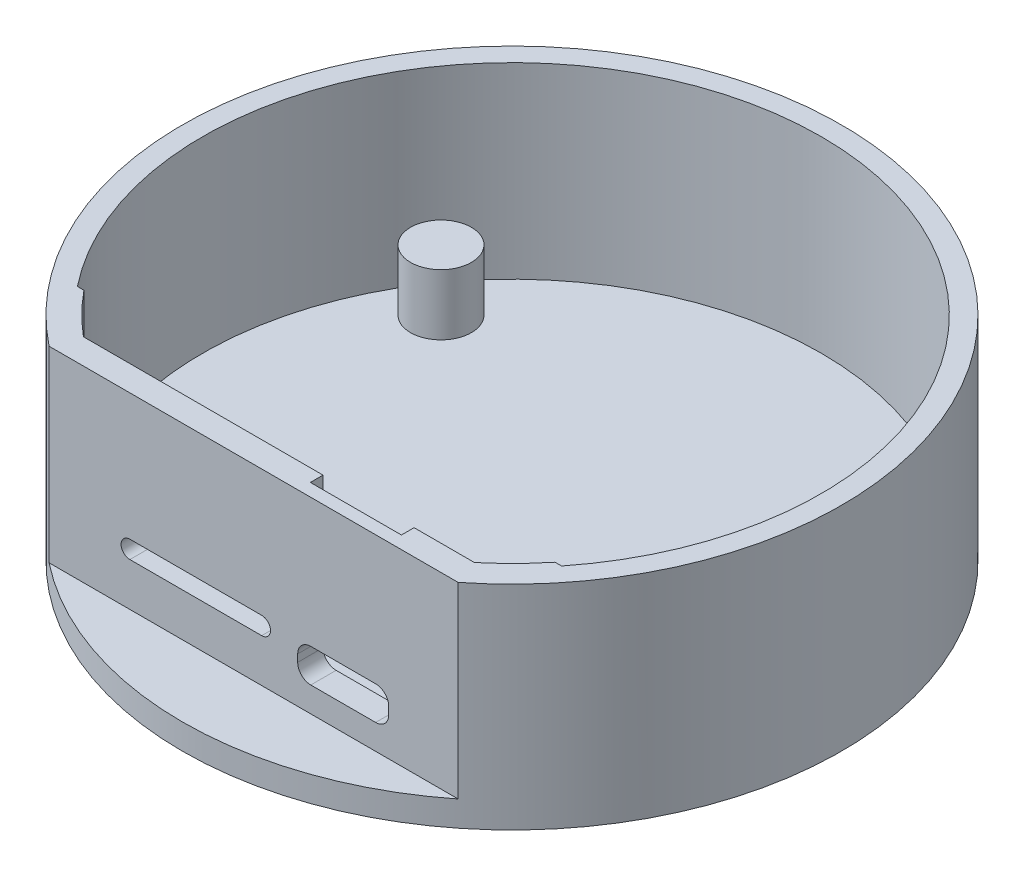
ISO-10303-21;
HEADER;
FILE_DESCRIPTION(('STEP AP214'),'2;1');
FILE_NAME('part.step','',(''),(''),'','','');
FILE_SCHEMA(('AUTOMOTIVE_DESIGN { 1 0 10303 214 1 1 1 1 }'));
ENDSEC;
DATA;
#1=APPLICATION_CONTEXT('core data for automotive mechanical design processes');
#2=APPLICATION_PROTOCOL_DEFINITION('international standard','automotive_design',2000,#1);
#3=PRODUCT_CONTEXT('',#1,'mechanical');
#4=PRODUCT('Part','Part','',(#3));
#5=PRODUCT_RELATED_PRODUCT_CATEGORY('part','',(#4));
#6=PRODUCT_DEFINITION_FORMATION('','',#4);
#7=PRODUCT_DEFINITION_CONTEXT('part definition',#1,'design');
#8=PRODUCT_DEFINITION('design','',#6,#7);
#9=PRODUCT_DEFINITION_SHAPE('','',#8);
#10=(LENGTH_UNIT() NAMED_UNIT(*) SI_UNIT(.MILLI.,.METRE.));
#11=(NAMED_UNIT(*) PLANE_ANGLE_UNIT() SI_UNIT($,.RADIAN.));
#12=(NAMED_UNIT(*) SI_UNIT($,.STERADIAN.) SOLID_ANGLE_UNIT());
#13=UNCERTAINTY_MEASURE_WITH_UNIT(LENGTH_MEASURE(1.E-05),#10,'distance_accuracy_value','');
#14=(GEOMETRIC_REPRESENTATION_CONTEXT(3) GLOBAL_UNCERTAINTY_ASSIGNED_CONTEXT((#13)) GLOBAL_UNIT_ASSIGNED_CONTEXT((#10,
#11,#12)) REPRESENTATION_CONTEXT('',''));
#15=CARTESIAN_POINT('',(0.,0.,0.));
#16=DIRECTION('',(0.,0.,1.));
#17=DIRECTION('',(1.,0.,0.));
#18=AXIS2_PLACEMENT_3D('',#15,#16,#17);
#19=CARTESIAN_POINT('',(0.,21.,0.));
#20=DIRECTION('',(0.,-1.,0.));
#21=DIRECTION('',(0.,0.,-1.));
#22=AXIS2_PLACEMENT_3D('',#19,#20,#21);
#23=CYLINDRICAL_SURFACE('',#22,30.);
#24=DIRECTION('',(0.,-1.,0.));
#25=VECTOR('',#24,1.);
#26=CARTESIAN_POINT('',(-23.2315496638173,21.,18.9814409415511));
#27=LINE('',#26,#25);
#28=CARTESIAN_POINT('',(-23.2315496638173,21.,18.9814409415511));
#29=VERTEX_POINT('',#28);
#30=CARTESIAN_POINT('',(-23.2315496638173,2.5,18.9814409415511));
#31=VERTEX_POINT('',#30);
#32=EDGE_CURVE('E48',#29,#31,#27,.T.);
#33=ORIENTED_EDGE('',*,*,#32,.F.);
#34=CARTESIAN_POINT('',(0.,21.,0.));
#35=DIRECTION('',(0.,1.,0.));
#36=DIRECTION('',(0.,0.,1.));
#37=AXIS2_PLACEMENT_3D('',#34,#35,#36);
#38=CIRCLE('',#37,30.);
#39=CARTESIAN_POINT('',(-19.2835,21.,22.9814409415511));
#40=VERTEX_POINT('',#39);
#41=EDGE_CURVE('E426',#29,#40,#38,.T.);
#42=ORIENTED_EDGE('',*,*,#41,.T.);
#43=DIRECTION('',(0.,-1.,0.));
#44=VECTOR('',#43,1.);
#45=CARTESIAN_POINT('',(-19.2835,21.,22.9814409415511));
#46=LINE('',#45,#44);
#47=CARTESIAN_POINT('',(-19.2835,2.5,22.9814409415511));
#48=VERTEX_POINT('',#47);
#49=EDGE_CURVE('E413',#48,#40,#46,.F.);
#50=ORIENTED_EDGE('',*,*,#49,.F.);
#51=CARTESIAN_POINT('',(0.,2.5,0.));
#52=DIRECTION('',(0.,1.,0.));
#53=DIRECTION('',(0.,0.,1.));
#54=AXIS2_PLACEMENT_3D('',#51,#52,#53);
#55=CIRCLE('',#54,30.);
#56=EDGE_CURVE('E421',#31,#48,#55,.T.);
#57=ORIENTED_EDGE('',*,*,#56,.F.);
#58=EDGE_LOOP('',(#33,#42,#50,#57));
#59=FACE_BOUND('',#58,.T.);
#60=ADVANCED_FACE('F39',(#59),#23,.F.);
#61=CARTESIAN_POINT('',(0.,2.5,0.));
#62=DIRECTION('',(0.,1.,0.));
#63=DIRECTION('',(0.,0.,1.));
#64=AXIS2_PLACEMENT_3D('',#61,#62,#63);
#65=PLANE('',#64);
#66=CARTESIAN_POINT('',(0.,2.5,0.));
#67=DIRECTION('',(0.,1.,0.));
#68=DIRECTION('',(0.,0.,1.));
#69=AXIS2_PLACEMENT_3D('',#66,#67,#68);
#70=CIRCLE('',#69,32.5);
#71=CARTESIAN_POINT('',(20.1729067697802,2.5,25.4814409415511));
#72=VERTEX_POINT('',#71);
#73=CARTESIAN_POINT('',(-20.1729067697802,2.5,25.4814409415511));
#74=VERTEX_POINT('',#73);
#75=EDGE_CURVE('E409',#72,#74,#70,.F.);
#76=ORIENTED_EDGE('',*,*,#75,.F.);
#77=DIRECTION('',(1.,0.,0.));
#78=VECTOR('',#77,1.);
#79=CARTESIAN_POINT('',(-20.1729067697802,2.5,25.4814409415511));
#80=LINE('',#79,#78);
#81=EDGE_CURVE('E385',#74,#72,#80,.T.);
#82=ORIENTED_EDGE('',*,*,#81,.F.);
#83=EDGE_LOOP('',(#76,#82));
#84=FACE_BOUND('',#83,.T.);
#85=ADVANCED_FACE('F517',(#84),#65,.T.);
#86=CARTESIAN_POINT('',(-17.,2.5,19.));
#87=DIRECTION('',(0.,1.,0.));
#88=DIRECTION('',(0.,0.,1.));
#89=AXIS2_PLACEMENT_3D('',#86,#87,#88);
#90=CIRCLE('',#89,3.);
#91=CARTESIAN_POINT('',(-17.,2.5,22.));
#92=VERTEX_POINT('',#91);
#93=EDGE_CURVE('E267',#92,#92,#90,.T.);
#94=ORIENTED_EDGE('',*,*,#93,.F.);
#95=EDGE_LOOP('',(#94));
#96=FACE_BOUND('',#95,.T.);
#97=CARTESIAN_POINT('',(22.,2.5,-15.));
#98=DIRECTION('',(0.,1.,0.));
#99=DIRECTION('',(0.,0.,1.));
#100=AXIS2_PLACEMENT_3D('',#97,#98,#99);
#101=CIRCLE('',#100,3.);
#102=CARTESIAN_POINT('',(22.,2.5,-12.));
#103=VERTEX_POINT('',#102);
#104=EDGE_CURVE('E344',#103,#103,#101,.T.);
#105=ORIENTED_EDGE('',*,*,#104,.F.);
#106=EDGE_LOOP('',(#105));
#107=FACE_BOUND('',#106,.T.);
#108=CARTESIAN_POINT('',(-22.,2.5,-15.));
#109=DIRECTION('',(0.,1.,0.));
#110=DIRECTION('',(0.,0.,1.));
#111=AXIS2_PLACEMENT_3D('',#108,#109,#110);
#112=CIRCLE('',#111,3.);
#113=CARTESIAN_POINT('',(-22.,2.5,-12.));
#114=VERTEX_POINT('',#113);
#115=EDGE_CURVE('E352',#114,#114,#112,.T.);
#116=ORIENTED_EDGE('',*,*,#115,.F.);
#117=EDGE_LOOP('',(#116));
#118=FACE_BOUND('',#117,.T.);
#119=CARTESIAN_POINT('',(19.2835,2.5,22.9814409415511));
#120=VERTEX_POINT('',#119);
#121=CARTESIAN_POINT('',(23.2315496638173,2.5,18.9814409415511));
#122=VERTEX_POINT('',#121);
#123=EDGE_CURVE('E422',#120,#122,#55,.T.);
#124=ORIENTED_EDGE('',*,*,#123,.T.);
#125=DIRECTION('',(-1.,0.,0.));
#126=VECTOR('',#125,1.);
#127=CARTESIAN_POINT('',(23.2315496638173,2.5,18.9814409415511));
#128=LINE('',#127,#126);
#129=CARTESIAN_POINT('',(23.8737282338224,2.5,18.9814409415511));
#130=VERTEX_POINT('',#129);
#131=EDGE_CURVE('E382',#130,#122,#128,.T.);
#132=ORIENTED_EDGE('',*,*,#131,.F.);
#133=CARTESIAN_POINT('',(0.,2.5,0.));
#134=DIRECTION('',(0.,1.,0.));
#135=DIRECTION('',(0.,0.,1.));
#136=AXIS2_PLACEMENT_3D('',#133,#134,#135);
#137=CIRCLE('',#136,30.5);
#138=CARTESIAN_POINT('',(-23.8737282338224,2.5,18.9814409415511));
#139=VERTEX_POINT('',#138);
#140=EDGE_CURVE('E364',#139,#130,#137,.F.);
#141=ORIENTED_EDGE('',*,*,#140,.F.);
#142=EDGE_CURVE('E367',#31,#139,#128,.T.);
#143=ORIENTED_EDGE('',*,*,#142,.F.);
#144=ORIENTED_EDGE('',*,*,#56,.T.);
#145=DIRECTION('',(-1.,0.,0.));
#146=VECTOR('',#145,1.);
#147=CARTESIAN_POINT('',(-22.9804998259394,2.5,22.9814409415511));
#148=LINE('',#147,#146);
#149=EDGE_CURVE('E391',#120,#48,#148,.T.);
#150=ORIENTED_EDGE('',*,*,#149,.F.);
#151=EDGE_LOOP('',(#124,#132,#141,#143,#144,#150));
#152=FACE_BOUND('',#151,.T.);
#153=ADVANCED_FACE('F473',(#96,#107,#118,#152),#65,.T.);
#154=CARTESIAN_POINT('',(0.,21.,0.));
#155=DIRECTION('',(0.,-1.,0.));
#156=DIRECTION('',(0.,0.,-1.));
#157=AXIS2_PLACEMENT_3D('',#154,#155,#156);
#158=CYLINDRICAL_SURFACE('',#157,32.5);
#159=ORIENTED_EDGE('',*,*,#75,.T.);
#160=DIRECTION('',(0.,-1.,0.));
#161=VECTOR('',#160,1.);
#162=CARTESIAN_POINT('',(-20.1729067697802,21.,25.4814409415511));
#163=LINE('',#162,#161);
#164=CARTESIAN_POINT('',(-20.1729067697802,21.,25.4814409415511));
#165=VERTEX_POINT('',#164);
#166=EDGE_CURVE('E405',#165,#74,#163,.T.);
#167=ORIENTED_EDGE('',*,*,#166,.F.);
#168=CARTESIAN_POINT('',(0.,21.,0.));
#169=DIRECTION('',(0.,1.,0.));
#170=DIRECTION('',(0.,0.,1.));
#171=AXIS2_PLACEMENT_3D('',#168,#169,#170);
#172=CIRCLE('',#171,32.5);
#173=CARTESIAN_POINT('',(20.1729067697802,21.,25.4814409415511));
#174=VERTEX_POINT('',#173);
#175=EDGE_CURVE('E432',#174,#165,#172,.T.);
#176=ORIENTED_EDGE('',*,*,#175,.F.);
#177=DIRECTION('',(0.,-1.,0.));
#178=VECTOR('',#177,1.);
#179=CARTESIAN_POINT('',(20.1729067697802,21.,25.4814409415511));
#180=LINE('',#179,#178);
#181=EDGE_CURVE('E395',#174,#72,#180,.T.);
#182=ORIENTED_EDGE('',*,*,#181,.T.);
#183=EDGE_LOOP('',(#159,#167,#176,#182));
#184=FACE_BOUND('',#183,.T.);
#185=CARTESIAN_POINT('',(0.,0.,0.));
#186=DIRECTION('',(0.,1.,0.));
#187=DIRECTION('',(0.,0.,1.));
#188=AXIS2_PLACEMENT_3D('',#185,#186,#187);
#189=CIRCLE('',#188,32.5);
#190=CARTESIAN_POINT('',(0.,0.,32.5));
#191=VERTEX_POINT('',#190);
#192=EDGE_CURVE('E431',#191,#191,#189,.T.);
#193=ORIENTED_EDGE('',*,*,#192,.T.);
#194=EDGE_LOOP('',(#193));
#195=FACE_BOUND('',#194,.T.);
#196=ADVANCED_FACE('F41',(#184,#195),#158,.T.);
#197=CARTESIAN_POINT('',(0.,21.,0.));
#198=DIRECTION('',(0.,1.,0.));
#199=DIRECTION('',(0.,0.,1.));
#200=AXIS2_PLACEMENT_3D('',#197,#198,#199);
#201=PLANE('',#200);
#202=DIRECTION('',(0.,0.,-1.));
#203=VECTOR('',#202,1.);
#204=CARTESIAN_POINT('',(13.33,21.,24.2314409415511));
#205=LINE('',#204,#203);
#206=CARTESIAN_POINT('',(13.33,21.,24.2314409415511));
#207=VERTEX_POINT('',#206);
#208=CARTESIAN_POINT('',(13.33,21.,22.9814409415511));
#209=VERTEX_POINT('',#208);
#210=EDGE_CURVE('E209',#207,#209,#205,.T.);
#211=ORIENTED_EDGE('',*,*,#210,.F.);
#212=DIRECTION('',(1.,0.,0.));
#213=VECTOR('',#212,1.);
#214=CARTESIAN_POINT('',(13.33,21.,24.2314409415511));
#215=LINE('',#214,#213);
#216=CARTESIAN_POINT('',(4.35,21.,24.2314409415511));
#217=VERTEX_POINT('',#216);
#218=EDGE_CURVE('E191',#217,#207,#215,.T.);
#219=ORIENTED_EDGE('',*,*,#218,.F.);
#220=DIRECTION('',(0.,0.,-1.));
#221=VECTOR('',#220,1.);
#222=CARTESIAN_POINT('',(4.35,21.,24.2314409415511));
#223=LINE('',#222,#221);
#224=CARTESIAN_POINT('',(4.35,21.,22.9814409415511));
#225=VERTEX_POINT('',#224);
#226=EDGE_CURVE('E201',#217,#225,#223,.T.);
#227=ORIENTED_EDGE('',*,*,#226,.T.);
#228=DIRECTION('',(-1.,0.,0.));
#229=VECTOR('',#228,1.);
#230=CARTESIAN_POINT('',(-22.9804998259394,21.,22.9814409415511));
#231=LINE('',#230,#229);
#232=EDGE_CURVE('E390',#225,#40,#231,.T.);
#233=ORIENTED_EDGE('',*,*,#232,.T.);
#234=ORIENTED_EDGE('',*,*,#41,.F.);
#235=DIRECTION('',(1.,0.,0.));
#236=VECTOR('',#235,1.);
#237=CARTESIAN_POINT('',(23.2315496638173,21.,18.9814409415511));
#238=LINE('',#237,#236);
#239=CARTESIAN_POINT('',(-23.8737282338224,21.,18.9814409415511));
#240=VERTEX_POINT('',#239);
#241=EDGE_CURVE('E373',#240,#29,#238,.T.);
#242=ORIENTED_EDGE('',*,*,#241,.F.);
#243=CARTESIAN_POINT('',(0.,21.,0.));
#244=DIRECTION('',(0.,1.,0.));
#245=DIRECTION('',(0.,0.,1.));
#246=AXIS2_PLACEMENT_3D('',#243,#244,#245);
#247=CIRCLE('',#246,30.5);
#248=CARTESIAN_POINT('',(23.8737282338224,21.,18.9814409415511));
#249=VERTEX_POINT('',#248);
#250=EDGE_CURVE('E360',#249,#240,#247,.T.);
#251=ORIENTED_EDGE('',*,*,#250,.F.);
#252=CARTESIAN_POINT('',(23.2315496638173,21.,18.9814409415511));
#253=VERTEX_POINT('',#252);
#254=EDGE_CURVE('E372',#253,#249,#238,.T.);
#255=ORIENTED_EDGE('',*,*,#254,.F.);
#256=CARTESIAN_POINT('',(19.2835,21.,22.9814409415511));
#257=VERTEX_POINT('',#256);
#258=EDGE_CURVE('E427',#257,#253,#38,.T.);
#259=ORIENTED_EDGE('',*,*,#258,.F.);
#260=EDGE_CURVE('E392',#257,#209,#231,.T.);
#261=ORIENTED_EDGE('',*,*,#260,.T.);
#262=EDGE_LOOP('',(#211,#219,#227,#233,#234,#242,#251,#255,#259,#261));
#263=FACE_BOUND('',#262,.T.);
#264=DIRECTION('',(1.,0.,0.));
#265=VECTOR('',#264,1.);
#266=CARTESIAN_POINT('',(-20.1729067697802,21.,25.4814409415511));
#267=LINE('',#266,#265);
#268=EDGE_CURVE('E386',#165,#174,#267,.T.);
#269=ORIENTED_EDGE('',*,*,#268,.T.);
#270=ORIENTED_EDGE('',*,*,#175,.T.);
#271=EDGE_LOOP('',(#269,#270));
#272=FACE_BOUND('',#271,.T.);
#273=ADVANCED_FACE('F211',(#263,#272),#201,.T.);
#274=CARTESIAN_POINT('',(0.,0.,0.));
#275=DIRECTION('',(0.,1.,0.));
#276=DIRECTION('',(0.,0.,1.));
#277=AXIS2_PLACEMENT_3D('',#274,#275,#276);
#278=PLANE('',#277);
#279=ORIENTED_EDGE('',*,*,#192,.F.);
#280=EDGE_LOOP('',(#279));
#281=FACE_BOUND('',#280,.T.);
#282=ADVANCED_FACE('F526',(#281),#278,.F.);
#283=DIRECTION('',(0.,-1.,0.));
#284=VECTOR('',#283,1.);
#285=CARTESIAN_POINT('',(23.2315496638173,21.,18.9814409415511));
#286=LINE('',#285,#284);
#287=EDGE_CURVE('E435',#122,#253,#286,.F.);
#288=ORIENTED_EDGE('',*,*,#287,.F.);
#289=ORIENTED_EDGE('',*,*,#123,.F.);
#290=DIRECTION('',(0.,-1.,0.));
#291=VECTOR('',#290,1.);
#292=CARTESIAN_POINT('',(19.2835,21.,22.9814409415511));
#293=LINE('',#292,#291);
#294=EDGE_CURVE('E417',#257,#120,#293,.T.);
#295=ORIENTED_EDGE('',*,*,#294,.F.);
#296=ORIENTED_EDGE('',*,*,#258,.T.);
#297=EDGE_LOOP('',(#288,#289,#295,#296));
#298=FACE_BOUND('',#297,.T.);
#299=ADVANCED_FACE('F475',(#298),#23,.F.);
#300=CARTESIAN_POINT('',(-20.1729067697802,21.,25.4814409415511));
#301=DIRECTION('',(0.,0.,-1.));
#302=DIRECTION('',(-1.,0.,0.));
#303=AXIS2_PLACEMENT_3D('',#300,#301,#302);
#304=PLANE('',#303);
#305=DIRECTION('',(1.,0.,0.));
#306=VECTOR('',#305,1.);
#307=CARTESIAN_POINT('',(-12.2,6.76457579412948,25.4814409415511));
#308=LINE('',#307,#306);
#309=CARTESIAN_POINT('',(-12.2,6.76457579412948,25.4814409415511));
#310=VERTEX_POINT('',#309);
#311=CARTESIAN_POINT('',(0.799999999999998,6.76457579412948,25.4814409415511));
#312=VERTEX_POINT('',#311);
#313=EDGE_CURVE('E239',#310,#312,#308,.T.);
#314=ORIENTED_EDGE('',*,*,#313,.F.);
#315=CARTESIAN_POINT('',(-12.2,7.63228789706474,25.4814409415511));
#316=DIRECTION('',(0.,0.,1.));
#317=DIRECTION('',(1.,0.,0.));
#318=AXIS2_PLACEMENT_3D('',#315,#316,#317);
#319=CIRCLE('',#318,0.867712102935259);
#320=CARTESIAN_POINT('',(-12.2,8.5,25.4814409415511));
#321=VERTEX_POINT('',#320);
#322=EDGE_CURVE('E62',#321,#310,#319,.T.);
#323=ORIENTED_EDGE('',*,*,#322,.F.);
#324=DIRECTION('',(-1.,0.,0.));
#325=VECTOR('',#324,1.);
#326=CARTESIAN_POINT('',(-12.2,8.5,25.4814409415511));
#327=LINE('',#326,#325);
#328=CARTESIAN_POINT('',(0.799999999999999,8.5,25.4814409415511));
#329=VERTEX_POINT('',#328);
#330=EDGE_CURVE('E247',#329,#321,#327,.T.);
#331=ORIENTED_EDGE('',*,*,#330,.F.);
#332=CARTESIAN_POINT('',(0.799999999999999,7.63228789706474,25.4814409415511));
#333=DIRECTION('',(0.,0.,1.));
#334=DIRECTION('',(1.,0.,0.));
#335=AXIS2_PLACEMENT_3D('',#332,#333,#334);
#336=CIRCLE('',#335,0.867712102935259);
#337=EDGE_CURVE('E243',#312,#329,#336,.T.);
#338=ORIENTED_EDGE('',*,*,#337,.F.);
#339=EDGE_LOOP('',(#314,#323,#331,#338));
#340=FACE_BOUND('',#339,.T.);
#341=DIRECTION('',(-1.,0.,0.));
#342=VECTOR('',#341,1.);
#343=CARTESIAN_POINT('',(5.64,8.27,25.4814409415511));
#344=LINE('',#343,#342);
#345=CARTESIAN_POINT('',(12.04,8.27,25.4814409415511));
#346=VERTEX_POINT('',#345);
#347=CARTESIAN_POINT('',(5.64,8.27,25.4814409415511));
#348=VERTEX_POINT('',#347);
#349=EDGE_CURVE('E290',#346,#348,#344,.T.);
#350=ORIENTED_EDGE('',*,*,#349,.F.);
#351=CARTESIAN_POINT('',(12.04,6.98,25.4814409415511));
#352=DIRECTION('',(0.,0.,1.));
#353=DIRECTION('',(-1.,0.,0.));
#354=AXIS2_PLACEMENT_3D('',#351,#352,#353);
#355=CIRCLE('',#354,1.29);
#356=CARTESIAN_POINT('',(13.33,6.98,25.4814409415511));
#357=VERTEX_POINT('',#356);
#358=EDGE_CURVE('E286',#357,#346,#355,.T.);
#359=ORIENTED_EDGE('',*,*,#358,.F.);
#360=DIRECTION('',(0.,1.,0.));
#361=VECTOR('',#360,1.);
#362=CARTESIAN_POINT('',(13.33,6.26,25.4814409415511));
#363=LINE('',#362,#361);
#364=CARTESIAN_POINT('',(13.33,6.26,25.4814409415511));
#365=VERTEX_POINT('',#364);
#366=EDGE_CURVE('E313',#365,#357,#363,.T.);
#367=ORIENTED_EDGE('',*,*,#366,.F.);
#368=CARTESIAN_POINT('',(12.04,6.26,25.4814409415511));
#369=DIRECTION('',(0.,0.,1.));
#370=DIRECTION('',(1.,0.,0.));
#371=AXIS2_PLACEMENT_3D('',#368,#369,#370);
#372=CIRCLE('',#371,1.29);
#373=CARTESIAN_POINT('',(12.04,4.97000000000001,25.4814409415511));
#374=VERTEX_POINT('',#373);
#375=EDGE_CURVE('E309',#374,#365,#372,.T.);
#376=ORIENTED_EDGE('',*,*,#375,.F.);
#377=DIRECTION('',(1.,0.,0.));
#378=VECTOR('',#377,1.);
#379=CARTESIAN_POINT('',(5.64,4.97,25.4814409415511));
#380=LINE('',#379,#378);
#381=CARTESIAN_POINT('',(5.64,4.97,25.4814409415511));
#382=VERTEX_POINT('',#381);
#383=EDGE_CURVE('E305',#382,#374,#380,.T.);
#384=ORIENTED_EDGE('',*,*,#383,.F.);
#385=CARTESIAN_POINT('',(5.64,6.26,25.4814409415511));
#386=DIRECTION('',(0.,0.,1.));
#387=DIRECTION('',(-1.,0.,0.));
#388=AXIS2_PLACEMENT_3D('',#385,#386,#387);
#389=CIRCLE('',#388,1.29);
#390=CARTESIAN_POINT('',(4.35,6.26,25.4814409415511));
#391=VERTEX_POINT('',#390);
#392=EDGE_CURVE('E301',#391,#382,#389,.T.);
#393=ORIENTED_EDGE('',*,*,#392,.F.);
#394=DIRECTION('',(0.,-1.,0.));
#395=VECTOR('',#394,1.);
#396=CARTESIAN_POINT('',(4.35,6.26,25.4814409415511));
#397=LINE('',#396,#395);
#398=CARTESIAN_POINT('',(4.35,6.98,25.4814409415511));
#399=VERTEX_POINT('',#398);
#400=EDGE_CURVE('E298',#399,#391,#397,.T.);
#401=ORIENTED_EDGE('',*,*,#400,.F.);
#402=CARTESIAN_POINT('',(5.64,6.98,25.4814409415511));
#403=DIRECTION('',(0.,0.,1.));
#404=DIRECTION('',(-1.,0.,0.));
#405=AXIS2_PLACEMENT_3D('',#402,#403,#404);
#406=CIRCLE('',#405,1.29);
#407=EDGE_CURVE('E294',#348,#399,#406,.T.);
#408=ORIENTED_EDGE('',*,*,#407,.F.);
#409=EDGE_LOOP('',(#350,#359,#367,#376,#384,#393,#401,#408));
#410=FACE_BOUND('',#409,.T.);
#411=ORIENTED_EDGE('',*,*,#81,.T.);
#412=ORIENTED_EDGE('',*,*,#181,.F.);
#413=ORIENTED_EDGE('',*,*,#268,.F.);
#414=ORIENTED_EDGE('',*,*,#166,.T.);
#415=EDGE_LOOP('',(#411,#412,#413,#414));
#416=FACE_BOUND('',#415,.T.);
#417=ADVANCED_FACE('F497',(#340,#410,#416),#304,.F.);
#418=CARTESIAN_POINT('',(-22.9804998259394,21.,22.9814409415511));
#419=DIRECTION('',(0.,0.,1.));
#420=DIRECTION('',(1.,0.,0.));
#421=AXIS2_PLACEMENT_3D('',#418,#419,#420);
#422=PLANE('',#421);
#423=DIRECTION('',(1.,0.,0.));
#424=VECTOR('',#423,1.);
#425=CARTESIAN_POINT('',(-12.2,8.5,22.9814409415511));
#426=LINE('',#425,#424);
#427=CARTESIAN_POINT('',(-12.2,8.5,22.9814409415511));
#428=VERTEX_POINT('',#427);
#429=CARTESIAN_POINT('',(0.799999999999999,8.5,22.9814409415511));
#430=VERTEX_POINT('',#429);
#431=EDGE_CURVE('E228',#428,#430,#426,.T.);
#432=ORIENTED_EDGE('',*,*,#431,.F.);
#433=CARTESIAN_POINT('',(-12.2,7.63228789706474,22.9814409415511));
#434=DIRECTION('',(0.,0.,1.));
#435=DIRECTION('',(1.,0.,0.));
#436=AXIS2_PLACEMENT_3D('',#433,#434,#435);
#437=CIRCLE('',#436,0.867712102935259);
#438=CARTESIAN_POINT('',(-12.2,6.76457579412948,22.9814409415511));
#439=VERTEX_POINT('',#438);
#440=EDGE_CURVE('E233',#439,#428,#437,.F.);
#441=ORIENTED_EDGE('',*,*,#440,.F.);
#442=DIRECTION('',(-1.,0.,0.));
#443=VECTOR('',#442,1.);
#444=CARTESIAN_POINT('',(-12.2,6.76457579412948,22.9814409415511));
#445=LINE('',#444,#443);
#446=CARTESIAN_POINT('',(0.799999999999999,6.76457579412948,22.9814409415511));
#447=VERTEX_POINT('',#446);
#448=EDGE_CURVE('E255',#447,#439,#445,.T.);
#449=ORIENTED_EDGE('',*,*,#448,.F.);
#450=CARTESIAN_POINT('',(0.799999999999999,7.63228789706474,22.9814409415511));
#451=DIRECTION('',(0.,0.,1.));
#452=DIRECTION('',(1.,0.,0.));
#453=AXIS2_PLACEMENT_3D('',#450,#451,#452);
#454=CIRCLE('',#453,0.867712102935259);
#455=EDGE_CURVE('E225',#430,#447,#454,.F.);
#456=ORIENTED_EDGE('',*,*,#455,.F.);
#457=EDGE_LOOP('',(#432,#441,#449,#456));
#458=FACE_BOUND('',#457,.T.);
#459=DIRECTION('',(0.,-1.,0.));
#460=VECTOR('',#459,1.);
#461=CARTESIAN_POINT('',(13.33,6.26,22.9814409415511));
#462=LINE('',#461,#460);
#463=CARTESIAN_POINT('',(13.33,6.26,22.9814409415511));
#464=VERTEX_POINT('',#463);
#465=EDGE_CURVE('E282',#209,#464,#462,.T.);
#466=ORIENTED_EDGE('',*,*,#465,.F.);
#467=ORIENTED_EDGE('',*,*,#260,.F.);
#468=ORIENTED_EDGE('',*,*,#294,.T.);
#469=ORIENTED_EDGE('',*,*,#149,.T.);
#470=ORIENTED_EDGE('',*,*,#49,.T.);
#471=ORIENTED_EDGE('',*,*,#232,.F.);
#472=DIRECTION('',(0.,1.,0.));
#473=VECTOR('',#472,1.);
#474=CARTESIAN_POINT('',(4.35,6.26,22.9814409415511));
#475=LINE('',#474,#473);
#476=CARTESIAN_POINT('',(4.35,6.26,22.9814409415511));
#477=VERTEX_POINT('',#476);
#478=EDGE_CURVE('E205',#477,#225,#475,.T.);
#479=ORIENTED_EDGE('',*,*,#478,.F.);
#480=CARTESIAN_POINT('',(5.64,6.26,22.9814409415511));
#481=DIRECTION('',(0.,0.,1.));
#482=DIRECTION('',(1.,0.,0.));
#483=AXIS2_PLACEMENT_3D('',#480,#481,#482);
#484=CIRCLE('',#483,1.29);
#485=CARTESIAN_POINT('',(5.64,4.97,22.9814409415511));
#486=VERTEX_POINT('',#485);
#487=EDGE_CURVE('E270',#486,#477,#484,.F.);
#488=ORIENTED_EDGE('',*,*,#487,.F.);
#489=DIRECTION('',(-1.,0.,0.));
#490=VECTOR('',#489,1.);
#491=CARTESIAN_POINT('',(5.63999999999999,4.97,22.9814409415511));
#492=LINE('',#491,#490);
#493=CARTESIAN_POINT('',(12.04,4.97000000000001,22.9814409415511));
#494=VERTEX_POINT('',#493);
#495=EDGE_CURVE('E274',#494,#486,#492,.T.);
#496=ORIENTED_EDGE('',*,*,#495,.F.);
#497=CARTESIAN_POINT('',(12.04,6.26,22.9814409415511));
#498=DIRECTION('',(0.,0.,1.));
#499=DIRECTION('',(1.,0.,0.));
#500=AXIS2_PLACEMENT_3D('',#497,#498,#499);
#501=CIRCLE('',#500,1.29);
#502=EDGE_CURVE('E278',#464,#494,#501,.F.);
#503=ORIENTED_EDGE('',*,*,#502,.F.);
#504=EDGE_LOOP('',(#466,#467,#468,#469,#470,#471,#479,#488,#496,#503));
#505=FACE_BOUND('',#504,.T.);
#506=ADVANCED_FACE('F470',(#458,#505),#422,.F.);
#507=CARTESIAN_POINT('',(23.2315496638173,-76.0456109381817,18.9814409415511));
#508=DIRECTION('',(0.,0.,1.));
#509=DIRECTION('',(1.,0.,0.));
#510=AXIS2_PLACEMENT_3D('',#507,#508,#509);
#511=PLANE('',#510);
#512=ORIENTED_EDGE('',*,*,#32,.T.);
#513=ORIENTED_EDGE('',*,*,#142,.T.);
#514=DIRECTION('',(0.,1.,0.));
#515=VECTOR('',#514,1.);
#516=CARTESIAN_POINT('',(-23.8737282338224,-76.0456109381817,18.9814409415511));
#517=LINE('',#516,#515);
#518=EDGE_CURVE('E376',#139,#240,#517,.T.);
#519=ORIENTED_EDGE('',*,*,#518,.T.);
#520=ORIENTED_EDGE('',*,*,#241,.T.);
#521=EDGE_LOOP('',(#512,#513,#519,#520));
#522=FACE_BOUND('',#521,.T.);
#523=ADVANCED_FACE('F445',(#522),#511,.F.);
#524=CARTESIAN_POINT('',(0.,-76.0456109381817,0.));
#525=DIRECTION('',(0.,1.,0.));
#526=DIRECTION('',(0.,0.,1.));
#527=AXIS2_PLACEMENT_3D('',#524,#525,#526);
#528=CYLINDRICAL_SURFACE('',#527,30.5);
#529=ORIENTED_EDGE('',*,*,#140,.T.);
#530=DIRECTION('',(0.,1.,0.));
#531=VECTOR('',#530,1.);
#532=CARTESIAN_POINT('',(23.8737282338224,-76.0456109381817,18.9814409415511));
#533=LINE('',#532,#531);
#534=EDGE_CURVE('E368',#130,#249,#533,.T.);
#535=ORIENTED_EDGE('',*,*,#534,.T.);
#536=ORIENTED_EDGE('',*,*,#250,.T.);
#537=ORIENTED_EDGE('',*,*,#518,.F.);
#538=EDGE_LOOP('',(#529,#535,#536,#537));
#539=FACE_BOUND('',#538,.T.);
#540=ADVANCED_FACE('F467',(#539),#528,.F.);
#541=ORIENTED_EDGE('',*,*,#287,.T.);
#542=ORIENTED_EDGE('',*,*,#254,.T.);
#543=ORIENTED_EDGE('',*,*,#534,.F.);
#544=ORIENTED_EDGE('',*,*,#131,.T.);
#545=EDGE_LOOP('',(#541,#542,#543,#544));
#546=FACE_BOUND('',#545,.T.);
#547=ADVANCED_FACE('F461',(#546),#511,.F.);
#548=CARTESIAN_POINT('',(-22.,8.5,-15.));
#549=DIRECTION('',(0.,-1.,0.));
#550=DIRECTION('',(0.,0.,-1.));
#551=AXIS2_PLACEMENT_3D('',#548,#549,#550);
#552=CYLINDRICAL_SURFACE('',#551,3.);
#553=CARTESIAN_POINT('',(-22.,8.5,-15.));
#554=DIRECTION('',(0.,1.,0.));
#555=DIRECTION('',(0.,0.,1.));
#556=AXIS2_PLACEMENT_3D('',#553,#554,#555);
#557=CIRCLE('',#556,3.);
#558=CARTESIAN_POINT('',(-22.,8.5,-12.));
#559=VERTEX_POINT('',#558);
#560=EDGE_CURVE('E356',#559,#559,#557,.T.);
#561=ORIENTED_EDGE('',*,*,#560,.F.);
#562=EDGE_LOOP('',(#561));
#563=FACE_BOUND('',#562,.T.);
#564=ORIENTED_EDGE('',*,*,#115,.T.);
#565=EDGE_LOOP('',(#564));
#566=FACE_BOUND('',#565,.T.);
#567=ADVANCED_FACE('F556',(#563,#566),#552,.T.);
#568=CARTESIAN_POINT('',(-22.,8.5,-15.));
#569=DIRECTION('',(0.,1.,0.));
#570=DIRECTION('',(0.,0.,1.));
#571=AXIS2_PLACEMENT_3D('',#568,#569,#570);
#572=PLANE('',#571);
#573=ORIENTED_EDGE('',*,*,#560,.T.);
#574=EDGE_LOOP('',(#573));
#575=FACE_BOUND('',#574,.T.);
#576=ADVANCED_FACE('F558',(#575),#572,.T.);
#577=CARTESIAN_POINT('',(22.,8.5,-15.));
#578=DIRECTION('',(0.,-1.,0.));
#579=DIRECTION('',(0.,0.,-1.));
#580=AXIS2_PLACEMENT_3D('',#577,#578,#579);
#581=CYLINDRICAL_SURFACE('',#580,3.);
#582=CARTESIAN_POINT('',(22.,8.5,-15.));
#583=DIRECTION('',(0.,1.,0.));
#584=DIRECTION('',(0.,0.,1.));
#585=AXIS2_PLACEMENT_3D('',#582,#583,#584);
#586=CIRCLE('',#585,3.);
#587=CARTESIAN_POINT('',(22.,8.5,-12.));
#588=VERTEX_POINT('',#587);
#589=EDGE_CURVE('E348',#588,#588,#586,.T.);
#590=ORIENTED_EDGE('',*,*,#589,.F.);
#591=EDGE_LOOP('',(#590));
#592=FACE_BOUND('',#591,.T.);
#593=ORIENTED_EDGE('',*,*,#104,.T.);
#594=EDGE_LOOP('',(#593));
#595=FACE_BOUND('',#594,.T.);
#596=ADVANCED_FACE('F565',(#592,#595),#581,.T.);
#597=CARTESIAN_POINT('',(22.,8.5,-15.));
#598=DIRECTION('',(0.,1.,0.));
#599=DIRECTION('',(0.,0.,1.));
#600=AXIS2_PLACEMENT_3D('',#597,#598,#599);
#601=PLANE('',#600);
#602=ORIENTED_EDGE('',*,*,#589,.T.);
#603=EDGE_LOOP('',(#602));
#604=FACE_BOUND('',#603,.T.);
#605=ADVANCED_FACE('F624',(#604),#601,.T.);
#606=CARTESIAN_POINT('',(-17.,8.5,19.));
#607=DIRECTION('',(0.,-1.,0.));
#608=DIRECTION('',(0.,0.,-1.));
#609=AXIS2_PLACEMENT_3D('',#606,#607,#608);
#610=CYLINDRICAL_SURFACE('',#609,3.);
#611=CARTESIAN_POINT('',(-17.,8.5,19.));
#612=DIRECTION('',(0.,1.,0.));
#613=DIRECTION('',(0.,0.,1.));
#614=AXIS2_PLACEMENT_3D('',#611,#612,#613);
#615=CIRCLE('',#614,3.);
#616=CARTESIAN_POINT('',(-17.,8.5,22.));
#617=VERTEX_POINT('',#616);
#618=EDGE_CURVE('E340',#617,#617,#615,.T.);
#619=ORIENTED_EDGE('',*,*,#618,.F.);
#620=EDGE_LOOP('',(#619));
#621=FACE_BOUND('',#620,.T.);
#622=ORIENTED_EDGE('',*,*,#93,.T.);
#623=EDGE_LOOP('',(#622));
#624=FACE_BOUND('',#623,.T.);
#625=ADVANCED_FACE('F620',(#621,#624),#610,.T.);
#626=CARTESIAN_POINT('',(-17.,8.5,19.));
#627=DIRECTION('',(0.,1.,0.));
#628=DIRECTION('',(0.,0.,1.));
#629=AXIS2_PLACEMENT_3D('',#626,#627,#628);
#630=PLANE('',#629);
#631=ORIENTED_EDGE('',*,*,#618,.T.);
#632=EDGE_LOOP('',(#631));
#633=FACE_BOUND('',#632,.T.);
#634=ADVANCED_FACE('F617',(#633),#630,.T.);
#635=CARTESIAN_POINT('',(12.04,6.98,-32.501));
#636=DIRECTION('',(0.,0.,1.));
#637=DIRECTION('',(1.,0.,0.));
#638=AXIS2_PLACEMENT_3D('',#635,#636,#637);
#639=CYLINDRICAL_SURFACE('',#638,1.29);
#640=DIRECTION('',(0.,0.,1.));
#641=VECTOR('',#640,1.);
#642=CARTESIAN_POINT('',(12.04,8.27,-32.501));
#643=LINE('',#642,#641);
#644=CARTESIAN_POINT('',(12.04,8.27,24.2314409415511));
#645=VERTEX_POINT('',#644);
#646=EDGE_CURVE('E317',#645,#346,#643,.T.);
#647=ORIENTED_EDGE('',*,*,#646,.F.);
#648=CARTESIAN_POINT('',(12.04,6.98,24.2314409415511));
#649=DIRECTION('',(0.,0.,1.));
#650=DIRECTION('',(1.,0.,0.));
#651=AXIS2_PLACEMENT_3D('',#648,#649,#650);
#652=CIRCLE('',#651,1.29);
#653=CARTESIAN_POINT('',(13.33,6.98,24.2314409415511));
#654=VERTEX_POINT('',#653);
#655=EDGE_CURVE('E55',#645,#654,#652,.F.);
#656=ORIENTED_EDGE('',*,*,#655,.T.);
#657=DIRECTION('',(0.,0.,1.));
#658=VECTOR('',#657,1.);
#659=CARTESIAN_POINT('',(13.33,6.98,-32.501));
#660=LINE('',#659,#658);
#661=EDGE_CURVE('E229',#654,#357,#660,.T.);
#662=ORIENTED_EDGE('',*,*,#661,.T.);
#663=ORIENTED_EDGE('',*,*,#358,.T.);
#664=EDGE_LOOP('',(#647,#656,#662,#663));
#665=FACE_BOUND('',#664,.T.);
#666=ADVANCED_FACE('F484',(#665),#639,.F.);
#667=CARTESIAN_POINT('',(13.33,6.26,-32.501));
#668=DIRECTION('',(1.,0.,0.));
#669=DIRECTION('',(0.,0.,-1.));
#670=AXIS2_PLACEMENT_3D('',#667,#668,#669);
#671=PLANE('',#670);
#672=ORIENTED_EDGE('',*,*,#661,.F.);
#673=DIRECTION('',(0.,-1.,0.));
#674=VECTOR('',#673,1.);
#675=CARTESIAN_POINT('',(13.33,6.26,24.2314409415511));
#676=LINE('',#675,#674);
#677=EDGE_CURVE('E198',#207,#654,#676,.T.);
#678=ORIENTED_EDGE('',*,*,#677,.F.);
#679=ORIENTED_EDGE('',*,*,#210,.T.);
#680=ORIENTED_EDGE('',*,*,#465,.T.);
#681=DIRECTION('',(0.,0.,1.));
#682=VECTOR('',#681,1.);
#683=CARTESIAN_POINT('',(13.33,6.26,-32.501));
#684=LINE('',#683,#682);
#685=EDGE_CURVE('E320',#464,#365,#684,.T.);
#686=ORIENTED_EDGE('',*,*,#685,.T.);
#687=ORIENTED_EDGE('',*,*,#366,.T.);
#688=EDGE_LOOP('',(#672,#678,#679,#680,#686,#687));
#689=FACE_BOUND('',#688,.T.);
#690=ADVANCED_FACE('F480',(#689),#671,.F.);
#691=CARTESIAN_POINT('',(12.04,6.26,-32.501));
#692=DIRECTION('',(0.,0.,1.));
#693=DIRECTION('',(1.,0.,0.));
#694=AXIS2_PLACEMENT_3D('',#691,#692,#693);
#695=CYLINDRICAL_SURFACE('',#694,1.29);
#696=ORIENTED_EDGE('',*,*,#502,.T.);
#697=DIRECTION('',(0.,0.,1.));
#698=VECTOR('',#697,1.);
#699=CARTESIAN_POINT('',(12.04,4.97000000000001,-32.501));
#700=LINE('',#699,#698);
#701=EDGE_CURVE('E323',#494,#374,#700,.T.);
#702=ORIENTED_EDGE('',*,*,#701,.T.);
#703=ORIENTED_EDGE('',*,*,#375,.T.);
#704=ORIENTED_EDGE('',*,*,#685,.F.);
#705=EDGE_LOOP('',(#696,#702,#703,#704));
#706=FACE_BOUND('',#705,.T.);
#707=ADVANCED_FACE('F506',(#706),#695,.F.);
#708=CARTESIAN_POINT('',(5.64,4.97,-32.501));
#709=DIRECTION('',(0.,-1.,0.));
#710=DIRECTION('',(1.,0.,0.));
#711=AXIS2_PLACEMENT_3D('',#708,#709,#710);
#712=PLANE('',#711);
#713=ORIENTED_EDGE('',*,*,#495,.T.);
#714=DIRECTION('',(0.,0.,1.));
#715=VECTOR('',#714,1.);
#716=CARTESIAN_POINT('',(5.64,4.97,-32.501));
#717=LINE('',#716,#715);
#718=EDGE_CURVE('E326',#486,#382,#717,.T.);
#719=ORIENTED_EDGE('',*,*,#718,.T.);
#720=ORIENTED_EDGE('',*,*,#383,.T.);
#721=ORIENTED_EDGE('',*,*,#701,.F.);
#722=EDGE_LOOP('',(#713,#719,#720,#721));
#723=FACE_BOUND('',#722,.T.);
#724=ADVANCED_FACE('F504',(#723),#712,.F.);
#725=CARTESIAN_POINT('',(5.64,6.26,-32.501));
#726=DIRECTION('',(0.,0.,1.));
#727=DIRECTION('',(1.,0.,0.));
#728=AXIS2_PLACEMENT_3D('',#725,#726,#727);
#729=CYLINDRICAL_SURFACE('',#728,1.29);
#730=ORIENTED_EDGE('',*,*,#487,.T.);
#731=DIRECTION('',(0.,0.,1.));
#732=VECTOR('',#731,1.);
#733=CARTESIAN_POINT('',(4.35,6.26,-32.501));
#734=LINE('',#733,#732);
#735=EDGE_CURVE('E329',#477,#391,#734,.T.);
#736=ORIENTED_EDGE('',*,*,#735,.T.);
#737=ORIENTED_EDGE('',*,*,#392,.T.);
#738=ORIENTED_EDGE('',*,*,#718,.F.);
#739=EDGE_LOOP('',(#730,#736,#737,#738));
#740=FACE_BOUND('',#739,.T.);
#741=ADVANCED_FACE('F501',(#740),#729,.F.);
#742=CARTESIAN_POINT('',(4.35,6.26,-32.501));
#743=DIRECTION('',(-1.,0.,0.));
#744=DIRECTION('',(0.,0.,1.));
#745=AXIS2_PLACEMENT_3D('',#742,#743,#744);
#746=PLANE('',#745);
#747=ORIENTED_EDGE('',*,*,#400,.T.);
#748=ORIENTED_EDGE('',*,*,#735,.F.);
#749=ORIENTED_EDGE('',*,*,#478,.T.);
#750=ORIENTED_EDGE('',*,*,#226,.F.);
#751=DIRECTION('',(0.,1.,0.));
#752=VECTOR('',#751,1.);
#753=CARTESIAN_POINT('',(4.35,6.26,24.2314409415511));
#754=LINE('',#753,#752);
#755=CARTESIAN_POINT('',(4.35,6.98,24.2314409415511));
#756=VERTEX_POINT('',#755);
#757=EDGE_CURVE('E187',#756,#217,#754,.T.);
#758=ORIENTED_EDGE('',*,*,#757,.F.);
#759=DIRECTION('',(0.,0.,1.));
#760=VECTOR('',#759,1.);
#761=CARTESIAN_POINT('',(4.35,6.98,-32.501));
#762=LINE('',#761,#760);
#763=EDGE_CURVE('E332',#756,#399,#762,.T.);
#764=ORIENTED_EDGE('',*,*,#763,.T.);
#765=EDGE_LOOP('',(#747,#748,#749,#750,#758,#764));
#766=FACE_BOUND('',#765,.T.);
#767=ADVANCED_FACE('F203',(#766),#746,.F.);
#768=CARTESIAN_POINT('',(5.64,6.98,-32.501));
#769=DIRECTION('',(0.,0.,1.));
#770=DIRECTION('',(1.,0.,0.));
#771=AXIS2_PLACEMENT_3D('',#768,#769,#770);
#772=CYLINDRICAL_SURFACE('',#771,1.29);
#773=ORIENTED_EDGE('',*,*,#763,.F.);
#774=CARTESIAN_POINT('',(5.64,6.98,24.2314409415511));
#775=DIRECTION('',(0.,0.,1.));
#776=DIRECTION('',(1.,0.,0.));
#777=AXIS2_PLACEMENT_3D('',#774,#775,#776);
#778=CIRCLE('',#777,1.29);
#779=CARTESIAN_POINT('',(5.64,8.27,24.2314409415511));
#780=VERTEX_POINT('',#779);
#781=EDGE_CURVE('E194',#756,#780,#778,.F.);
#782=ORIENTED_EDGE('',*,*,#781,.T.);
#783=DIRECTION('',(0.,0.,1.));
#784=VECTOR('',#783,1.);
#785=CARTESIAN_POINT('',(5.64,8.27,-32.501));
#786=LINE('',#785,#784);
#787=EDGE_CURVE('E335',#780,#348,#786,.T.);
#788=ORIENTED_EDGE('',*,*,#787,.T.);
#789=ORIENTED_EDGE('',*,*,#407,.T.);
#790=EDGE_LOOP('',(#773,#782,#788,#789));
#791=FACE_BOUND('',#790,.T.);
#792=ADVANCED_FACE('F492',(#791),#772,.F.);
#793=CARTESIAN_POINT('',(5.64,8.27,-32.501));
#794=DIRECTION('',(0.,1.,0.));
#795=DIRECTION('',(0.,0.,1.));
#796=AXIS2_PLACEMENT_3D('',#793,#794,#795);
#797=PLANE('',#796);
#798=ORIENTED_EDGE('',*,*,#787,.F.);
#799=DIRECTION('',(1.,0.,0.));
#800=VECTOR('',#799,1.);
#801=CARTESIAN_POINT('',(5.63999999999997,8.27,24.2314409415511));
#802=LINE('',#801,#800);
#803=EDGE_CURVE('E11',#780,#645,#802,.T.);
#804=ORIENTED_EDGE('',*,*,#803,.T.);
#805=ORIENTED_EDGE('',*,*,#646,.T.);
#806=ORIENTED_EDGE('',*,*,#349,.T.);
#807=EDGE_LOOP('',(#798,#804,#805,#806));
#808=FACE_BOUND('',#807,.T.);
#809=ADVANCED_FACE('F489',(#808),#797,.F.);
#810=CARTESIAN_POINT('',(-12.2,7.63228789706474,-32.501));
#811=DIRECTION('',(0.,0.,1.));
#812=DIRECTION('',(1.,0.,0.));
#813=AXIS2_PLACEMENT_3D('',#810,#811,#812);
#814=CYLINDRICAL_SURFACE('',#813,0.867712102935259);
#815=ORIENTED_EDGE('',*,*,#440,.T.);
#816=DIRECTION('',(0.,0.,1.));
#817=VECTOR('',#816,1.);
#818=CARTESIAN_POINT('',(-12.2,8.5,-32.501));
#819=LINE('',#818,#817);
#820=EDGE_CURVE('E252',#428,#321,#819,.T.);
#821=ORIENTED_EDGE('',*,*,#820,.T.);
#822=ORIENTED_EDGE('',*,*,#322,.T.);
#823=DIRECTION('',(0.,0.,1.));
#824=VECTOR('',#823,1.);
#825=CARTESIAN_POINT('',(-12.2,6.76457579412948,-32.501));
#826=LINE('',#825,#824);
#827=EDGE_CURVE('E251',#439,#310,#826,.T.);
#828=ORIENTED_EDGE('',*,*,#827,.F.);
#829=EDGE_LOOP('',(#815,#821,#822,#828));
#830=FACE_BOUND('',#829,.T.);
#831=ADVANCED_FACE('F586',(#830),#814,.F.);
#832=CARTESIAN_POINT('',(-12.2,8.5,-32.501));
#833=DIRECTION('',(0.,1.,0.));
#834=DIRECTION('',(-1.,0.,0.));
#835=AXIS2_PLACEMENT_3D('',#832,#833,#834);
#836=PLANE('',#835);
#837=ORIENTED_EDGE('',*,*,#431,.T.);
#838=DIRECTION('',(0.,0.,1.));
#839=VECTOR('',#838,1.);
#840=CARTESIAN_POINT('',(0.799999999999999,8.5,-32.501));
#841=LINE('',#840,#839);
#842=EDGE_CURVE('E256',#430,#329,#841,.T.);
#843=ORIENTED_EDGE('',*,*,#842,.T.);
#844=ORIENTED_EDGE('',*,*,#330,.T.);
#845=ORIENTED_EDGE('',*,*,#820,.F.);
#846=EDGE_LOOP('',(#837,#843,#844,#845));
#847=FACE_BOUND('',#846,.T.);
#848=ADVANCED_FACE('F584',(#847),#836,.F.);
#849=CARTESIAN_POINT('',(0.799999999999999,7.63228789706474,-32.501));
#850=DIRECTION('',(0.,0.,1.));
#851=DIRECTION('',(1.,0.,0.));
#852=AXIS2_PLACEMENT_3D('',#849,#850,#851);
#853=CYLINDRICAL_SURFACE('',#852,0.867712102935259);
#854=ORIENTED_EDGE('',*,*,#455,.T.);
#855=DIRECTION('',(0.,0.,1.));
#856=VECTOR('',#855,1.);
#857=CARTESIAN_POINT('',(0.799999999999998,6.76457579412948,-32.501));
#858=LINE('',#857,#856);
#859=EDGE_CURVE('E259',#447,#312,#858,.T.);
#860=ORIENTED_EDGE('',*,*,#859,.T.);
#861=ORIENTED_EDGE('',*,*,#337,.T.);
#862=ORIENTED_EDGE('',*,*,#842,.F.);
#863=EDGE_LOOP('',(#854,#860,#861,#862));
#864=FACE_BOUND('',#863,.T.);
#865=ADVANCED_FACE('F593',(#864),#853,.F.);
#866=CARTESIAN_POINT('',(-12.2,6.76457579412948,-32.501));
#867=DIRECTION('',(0.,-1.,0.));
#868=DIRECTION('',(1.,0.,0.));
#869=AXIS2_PLACEMENT_3D('',#866,#867,#868);
#870=PLANE('',#869);
#871=ORIENTED_EDGE('',*,*,#448,.T.);
#872=ORIENTED_EDGE('',*,*,#827,.T.);
#873=ORIENTED_EDGE('',*,*,#313,.T.);
#874=ORIENTED_EDGE('',*,*,#859,.F.);
#875=EDGE_LOOP('',(#871,#872,#873,#874));
#876=FACE_BOUND('',#875,.T.);
#877=ADVANCED_FACE('F590',(#876),#870,.F.);
#878=CARTESIAN_POINT('',(0.,0.,24.2314409415511));
#879=DIRECTION('',(0.,0.,1.));
#880=DIRECTION('',(1.,0.,0.));
#881=AXIS2_PLACEMENT_3D('',#878,#879,#880);
#882=PLANE('',#881);
#883=ORIENTED_EDGE('',*,*,#803,.F.);
#884=ORIENTED_EDGE('',*,*,#781,.F.);
#885=ORIENTED_EDGE('',*,*,#757,.T.);
#886=ORIENTED_EDGE('',*,*,#218,.T.);
#887=ORIENTED_EDGE('',*,*,#677,.T.);
#888=ORIENTED_EDGE('',*,*,#655,.F.);
#889=EDGE_LOOP('',(#883,#884,#885,#886,#887,#888));
#890=FACE_BOUND('',#889,.T.);
#891=ADVANCED_FACE('F189',(#890),#882,.F.);
#892=CLOSED_SHELL('',(#60,#85,#153,#196,#273,#282,#299,#417,#506,#523,#540,#547,#567,#576,#596,
#605,#625,#634,#666,#690,#707,#724,#741,#767,#792,#809,#831,#848,#865,#877,#891));
#893=MANIFOLD_SOLID_BREP('B2',#892);
#894=ADVANCED_BREP_SHAPE_REPRESENTATION('',(#18,#893),#14);
#895=SHAPE_DEFINITION_REPRESENTATION(#9,#894);
ENDSEC;
END-ISO-10303-21;
